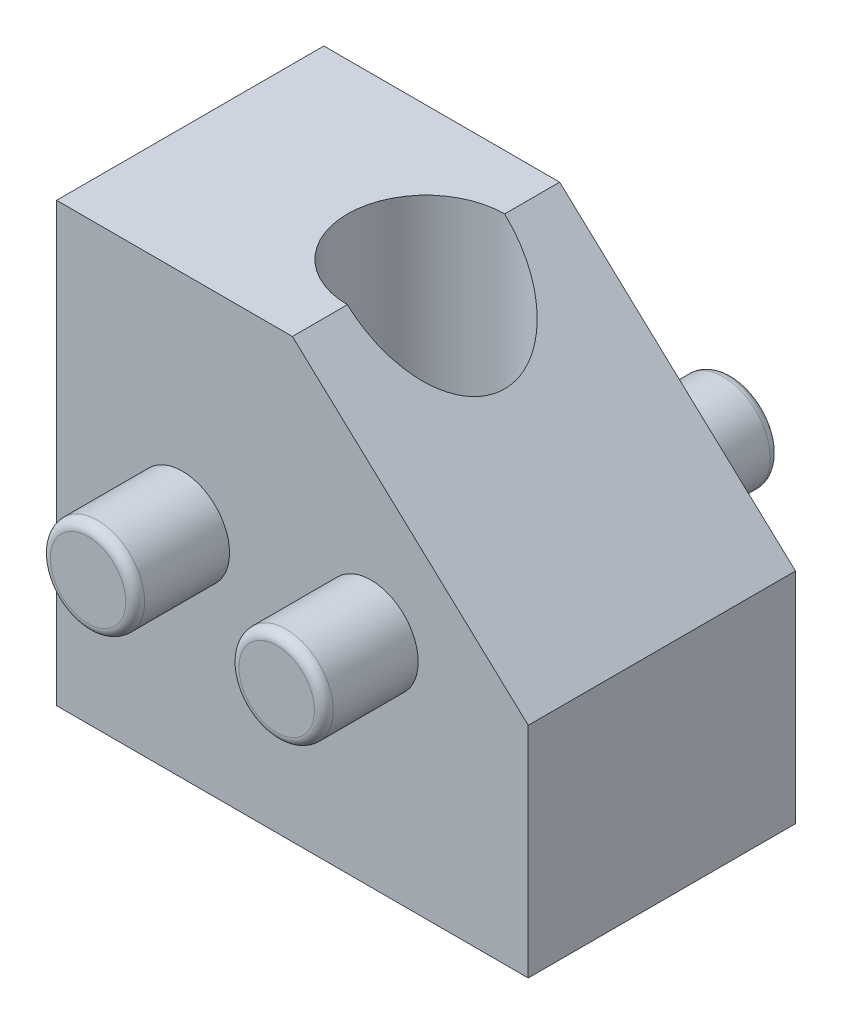
ISO-10303-21;
HEADER;
FILE_DESCRIPTION(('STEP AP214'),'2;1');
FILE_NAME('part.step','',(''),(''),'','','');
FILE_SCHEMA(('AUTOMOTIVE_DESIGN { 1 0 10303 214 1 1 1 1 }'));
ENDSEC;
DATA;
#1=APPLICATION_CONTEXT('core data for automotive mechanical design processes');
#2=APPLICATION_PROTOCOL_DEFINITION('international standard','automotive_design',2000,#1);
#3=PRODUCT_CONTEXT('',#1,'mechanical');
#4=PRODUCT('Part','Part','',(#3));
#5=PRODUCT_RELATED_PRODUCT_CATEGORY('part','',(#4));
#6=PRODUCT_DEFINITION_FORMATION('','',#4);
#7=PRODUCT_DEFINITION_CONTEXT('part definition',#1,'design');
#8=PRODUCT_DEFINITION('design','',#6,#7);
#9=PRODUCT_DEFINITION_SHAPE('','',#8);
#10=(LENGTH_UNIT() NAMED_UNIT(*) SI_UNIT(.MILLI.,.METRE.));
#11=(NAMED_UNIT(*) PLANE_ANGLE_UNIT() SI_UNIT($,.RADIAN.));
#12=(NAMED_UNIT(*) SI_UNIT($,.STERADIAN.) SOLID_ANGLE_UNIT());
#13=UNCERTAINTY_MEASURE_WITH_UNIT(LENGTH_MEASURE(1.E-05),#10,'distance_accuracy_value','');
#14=(GEOMETRIC_REPRESENTATION_CONTEXT(3) GLOBAL_UNCERTAINTY_ASSIGNED_CONTEXT((#13)) GLOBAL_UNIT_ASSIGNED_CONTEXT((#10,
#11,#12)) REPRESENTATION_CONTEXT('',''));
#15=CARTESIAN_POINT('',(0.,0.,0.));
#16=DIRECTION('',(0.,0.,1.));
#17=DIRECTION('',(1.,0.,0.));
#18=AXIS2_PLACEMENT_3D('',#15,#16,#17);
#19=CARTESIAN_POINT('',(8.93951134705922,0.,8.5));
#20=DIRECTION('',(1.,0.,0.));
#21=DIRECTION('',(0.,0.,-1.));
#22=AXIS2_PLACEMENT_3D('',#19,#20,#21);
#23=PLANE('',#22);
#24=DIRECTION('',(0.,-1.,0.));
#25=VECTOR('',#24,1.);
#26=CARTESIAN_POINT('',(8.93951134705922,0.,0.));
#27=LINE('',#26,#25);
#28=CARTESIAN_POINT('',(8.93951134705922,-1.33586653007096,0.));
#29=VERTEX_POINT('',#28);
#30=CARTESIAN_POINT('',(8.93951134705922,-8.29586653007096,0.));
#31=VERTEX_POINT('',#30);
#32=EDGE_CURVE('E123',#29,#31,#27,.T.);
#33=ORIENTED_EDGE('',*,*,#32,.F.);
#34=DIRECTION('',(0.,0.,-1.));
#35=VECTOR('',#34,1.);
#36=CARTESIAN_POINT('',(8.93951134705922,-1.33586653007096,8.5));
#37=LINE('',#36,#35);
#38=CARTESIAN_POINT('',(8.93951134705922,-1.33586653007096,8.5));
#39=VERTEX_POINT('',#38);
#40=EDGE_CURVE('E87',#39,#29,#37,.T.);
#41=ORIENTED_EDGE('',*,*,#40,.F.);
#42=DIRECTION('',(0.,-1.,0.));
#43=VECTOR('',#42,1.);
#44=CARTESIAN_POINT('',(8.93951134705922,0.,8.5));
#45=LINE('',#44,#43);
#46=CARTESIAN_POINT('',(8.93951134705922,-8.29586653007096,8.5));
#47=VERTEX_POINT('',#46);
#48=EDGE_CURVE('E118',#39,#47,#45,.T.);
#49=ORIENTED_EDGE('',*,*,#48,.T.);
#50=DIRECTION('',(0.,0.,-1.));
#51=VECTOR('',#50,1.);
#52=CARTESIAN_POINT('',(8.93951134705922,-8.29586653007096,8.5));
#53=LINE('',#52,#51);
#54=EDGE_CURVE('E82',#47,#31,#53,.T.);
#55=ORIENTED_EDGE('',*,*,#54,.T.);
#56=EDGE_LOOP('',(#33,#41,#49,#55));
#57=FACE_BOUND('',#56,.T.);
#58=ADVANCED_FACE('F35',(#57),#23,.T.);
#59=CARTESIAN_POINT('',(3.47030707334686,3.73955503593411,8.5));
#60=DIRECTION('',(-0.680226146057016,-0.73300231256144,0.));
#61=DIRECTION('',(0.73300231256144,-0.680226146057016,0.));
#62=AXIS2_PLACEMENT_3D('',#59,#60,#61);
#63=PLANE('',#62);
#64=DIRECTION('',(0.,0.,-1.));
#65=VECTOR('',#64,1.);
#66=CARTESIAN_POINT('',(1.43951134705922,5.62413346992904,8.5));
#67=LINE('',#66,#65);
#68=CARTESIAN_POINT('',(1.43951134705922,5.62413346992904,1.75));
#69=VERTEX_POINT('',#68);
#70=CARTESIAN_POINT('',(1.43951134705922,5.62413346992904,0.));
#71=VERTEX_POINT('',#70);
#72=EDGE_CURVE('E106',#69,#71,#67,.T.);
#73=ORIENTED_EDGE('',*,*,#72,.F.);
#74=CARTESIAN_POINT('',(1.43951134705922,5.62413346992904,4.25));
#75=DIRECTION('',(-0.680226146057016,-0.73300231256144,0.));
#76=DIRECTION('',(0.73300231256144,-0.680226146057016,0.));
#77=AXIS2_PLACEMENT_3D('',#74,#75,#76);
#78=ELLIPSE('',#77,3.41063044025587,2.5);
#79=CARTESIAN_POINT('',(1.43951134705922,5.62413346992904,6.75));
#80=VERTEX_POINT('',#79);
#81=EDGE_CURVE('E140',#69,#80,#78,.T.);
#82=ORIENTED_EDGE('',*,*,#81,.T.);
#83=CARTESIAN_POINT('',(1.43951134705922,5.62413346992904,8.5));
#84=VERTEX_POINT('',#83);
#85=EDGE_CURVE('E137',#84,#80,#67,.T.);
#86=ORIENTED_EDGE('',*,*,#85,.F.);
#87=DIRECTION('',(-0.73300231256144,0.680226146057016,0.));
#88=VECTOR('',#87,1.);
#89=CARTESIAN_POINT('',(3.47030707334686,3.73955503593411,8.5));
#90=LINE('',#89,#88);
#91=EDGE_CURVE('E115',#39,#84,#90,.T.);
#92=ORIENTED_EDGE('',*,*,#91,.F.);
#93=ORIENTED_EDGE('',*,*,#40,.T.);
#94=DIRECTION('',(-0.73300231256144,0.680226146057016,0.));
#95=VECTOR('',#94,1.);
#96=CARTESIAN_POINT('',(3.47030707334686,3.73955503593411,0.));
#97=LINE('',#96,#95);
#98=EDGE_CURVE('E126',#29,#71,#97,.T.);
#99=ORIENTED_EDGE('',*,*,#98,.T.);
#100=EDGE_LOOP('',(#73,#82,#86,#92,#93,#99));
#101=FACE_BOUND('',#100,.T.);
#102=ADVANCED_FACE('F174',(#101),#63,.F.);
#103=CARTESIAN_POINT('',(0.,5.62413346992904,8.5));
#104=DIRECTION('',(0.,1.,0.));
#105=DIRECTION('',(0.,0.,1.));
#106=AXIS2_PLACEMENT_3D('',#103,#104,#105);
#107=PLANE('',#106);
#108=CARTESIAN_POINT('',(1.43951134705922,5.62413346992904,4.25));
#109=DIRECTION('',(0.,1.,0.));
#110=DIRECTION('',(0.,0.,1.));
#111=AXIS2_PLACEMENT_3D('',#108,#109,#110);
#112=CIRCLE('',#111,2.5);
#113=EDGE_CURVE('E49',#69,#80,#112,.T.);
#114=ORIENTED_EDGE('',*,*,#113,.F.);
#115=ORIENTED_EDGE('',*,*,#72,.T.);
#116=DIRECTION('',(1.,0.,0.));
#117=VECTOR('',#116,1.);
#118=CARTESIAN_POINT('',(0.,5.62413346992904,0.));
#119=LINE('',#118,#117);
#120=CARTESIAN_POINT('',(-6.06048865294078,5.62413346992904,0.));
#121=VERTEX_POINT('',#120);
#122=EDGE_CURVE('E103',#121,#71,#119,.T.);
#123=ORIENTED_EDGE('',*,*,#122,.F.);
#124=DIRECTION('',(0.,0.,-1.));
#125=VECTOR('',#124,1.);
#126=CARTESIAN_POINT('',(-6.06048865294078,5.62413346992904,8.5));
#127=LINE('',#126,#125);
#128=CARTESIAN_POINT('',(-6.06048865294078,5.62413346992904,8.5));
#129=VERTEX_POINT('',#128);
#130=EDGE_CURVE('E96',#129,#121,#127,.T.);
#131=ORIENTED_EDGE('',*,*,#130,.F.);
#132=DIRECTION('',(1.,0.,0.));
#133=VECTOR('',#132,1.);
#134=CARTESIAN_POINT('',(0.,5.62413346992904,8.5));
#135=LINE('',#134,#133);
#136=EDGE_CURVE('E101',#129,#84,#135,.T.);
#137=ORIENTED_EDGE('',*,*,#136,.T.);
#138=ORIENTED_EDGE('',*,*,#85,.T.);
#139=EDGE_LOOP('',(#114,#115,#123,#131,#137,#138));
#140=FACE_BOUND('',#139,.T.);
#141=ADVANCED_FACE('F98',(#140),#107,.T.);
#142=CARTESIAN_POINT('',(-6.06048865294078,0.,8.5));
#143=DIRECTION('',(1.,0.,0.));
#144=DIRECTION('',(0.,1.,0.));
#145=AXIS2_PLACEMENT_3D('',#142,#143,#144);
#146=PLANE('',#145);
#147=DIRECTION('',(0.,-1.,0.));
#148=VECTOR('',#147,1.);
#149=CARTESIAN_POINT('',(-6.06048865294078,0.,0.));
#150=LINE('',#149,#148);
#151=CARTESIAN_POINT('',(-6.06048865294078,-8.29586653007096,0.));
#152=VERTEX_POINT('',#151);
#153=EDGE_CURVE('E131',#121,#152,#150,.T.);
#154=ORIENTED_EDGE('',*,*,#153,.T.);
#155=DIRECTION('',(0.,0.,-1.));
#156=VECTOR('',#155,1.);
#157=CARTESIAN_POINT('',(-6.06048865294078,-8.29586653007096,8.5));
#158=LINE('',#157,#156);
#159=CARTESIAN_POINT('',(-6.06048865294078,-8.29586653007096,8.5));
#160=VERTEX_POINT('',#159);
#161=EDGE_CURVE('E107',#160,#152,#158,.T.);
#162=ORIENTED_EDGE('',*,*,#161,.F.);
#163=DIRECTION('',(0.,-1.,0.));
#164=VECTOR('',#163,1.);
#165=CARTESIAN_POINT('',(-6.06048865294078,0.,8.5));
#166=LINE('',#165,#164);
#167=EDGE_CURVE('E110',#129,#160,#166,.T.);
#168=ORIENTED_EDGE('',*,*,#167,.F.);
#169=ORIENTED_EDGE('',*,*,#130,.T.);
#170=EDGE_LOOP('',(#154,#162,#168,#169));
#171=FACE_BOUND('',#170,.T.);
#172=ADVANCED_FACE('F111',(#171),#146,.F.);
#173=CARTESIAN_POINT('',(0.,-8.29586653007096,8.5));
#174=DIRECTION('',(0.,1.,0.));
#175=DIRECTION('',(0.,0.,1.));
#176=AXIS2_PLACEMENT_3D('',#173,#174,#175);
#177=PLANE('',#176);
#178=CARTESIAN_POINT('',(1.43951134705922,-8.29586653007096,4.25));
#179=DIRECTION('',(0.,-1.,0.));
#180=DIRECTION('',(0.,0.,-1.));
#181=AXIS2_PLACEMENT_3D('',#178,#179,#180);
#182=CIRCLE('',#181,2.5);
#183=CARTESIAN_POINT('',(1.43951134705922,-8.29586653007096,1.75));
#184=VERTEX_POINT('',#183);
#185=EDGE_CURVE('E217',#184,#184,#182,.T.);
#186=ORIENTED_EDGE('',*,*,#185,.F.);
#187=EDGE_LOOP('',(#186));
#188=FACE_BOUND('',#187,.T.);
#189=DIRECTION('',(1.,0.,0.));
#190=VECTOR('',#189,1.);
#191=CARTESIAN_POINT('',(0.,-8.29586653007096,0.));
#192=LINE('',#191,#190);
#193=EDGE_CURVE('E133',#152,#31,#192,.T.);
#194=ORIENTED_EDGE('',*,*,#193,.T.);
#195=ORIENTED_EDGE('',*,*,#54,.F.);
#196=DIRECTION('',(1.,0.,0.));
#197=VECTOR('',#196,1.);
#198=CARTESIAN_POINT('',(0.,-8.29586653007096,8.5));
#199=LINE('',#198,#197);
#200=EDGE_CURVE('E58',#160,#47,#199,.T.);
#201=ORIENTED_EDGE('',*,*,#200,.F.);
#202=ORIENTED_EDGE('',*,*,#161,.T.);
#203=EDGE_LOOP('',(#194,#195,#201,#202));
#204=FACE_BOUND('',#203,.T.);
#205=ADVANCED_FACE('F222',(#188,#204),#177,.F.);
#206=CARTESIAN_POINT('',(0.,0.,8.5));
#207=DIRECTION('',(0.,0.,1.));
#208=DIRECTION('',(1.,0.,0.));
#209=AXIS2_PLACEMENT_3D('',#206,#207,#208);
#210=PLANE('',#209);
#211=CARTESIAN_POINT('',(3.93951134705922,-1.33586653007095,8.5));
#212=DIRECTION('',(0.,0.,1.));
#213=DIRECTION('',(1.,0.,0.));
#214=AXIS2_PLACEMENT_3D('',#211,#212,#213);
#215=CIRCLE('',#214,1.5);
#216=CARTESIAN_POINT('',(5.43951134705922,-1.33586653007095,8.5));
#217=VERTEX_POINT('',#216);
#218=EDGE_CURVE('E211',#217,#217,#215,.F.);
#219=ORIENTED_EDGE('',*,*,#218,.T.);
#220=EDGE_LOOP('',(#219));
#221=FACE_BOUND('',#220,.T.);
#222=CARTESIAN_POINT('',(-2.06048865294078,-1.33586653007096,8.5));
#223=DIRECTION('',(0.,0.,1.));
#224=DIRECTION('',(1.,0.,0.));
#225=AXIS2_PLACEMENT_3D('',#222,#223,#224);
#226=CIRCLE('',#225,1.5);
#227=CARTESIAN_POINT('',(-0.560488652940779,-1.33586653007096,8.5));
#228=VERTEX_POINT('',#227);
#229=EDGE_CURVE('E206',#228,#228,#226,.F.);
#230=ORIENTED_EDGE('',*,*,#229,.T.);
#231=EDGE_LOOP('',(#230));
#232=FACE_BOUND('',#231,.T.);
#233=ORIENTED_EDGE('',*,*,#48,.F.);
#234=ORIENTED_EDGE('',*,*,#91,.T.);
#235=ORIENTED_EDGE('',*,*,#136,.F.);
#236=ORIENTED_EDGE('',*,*,#167,.T.);
#237=ORIENTED_EDGE('',*,*,#200,.T.);
#238=EDGE_LOOP('',(#233,#234,#235,#236,#237));
#239=FACE_BOUND('',#238,.T.);
#240=ADVANCED_FACE('F114',(#221,#232,#239),#210,.T.);
#241=CARTESIAN_POINT('',(0.,0.,0.));
#242=DIRECTION('',(0.,0.,1.));
#243=DIRECTION('',(1.,0.,0.));
#244=AXIS2_PLACEMENT_3D('',#241,#242,#243);
#245=PLANE('',#244);
#246=CARTESIAN_POINT('',(-2.06048865294078,-1.33586653007096,0.));
#247=DIRECTION('',(0.,0.,1.));
#248=DIRECTION('',(1.,0.,0.));
#249=AXIS2_PLACEMENT_3D('',#246,#247,#248);
#250=CIRCLE('',#249,1.5);
#251=CARTESIAN_POINT('',(-0.560488652940779,-1.33586653007096,0.));
#252=VERTEX_POINT('',#251);
#253=EDGE_CURVE('E204',#252,#252,#250,.T.);
#254=ORIENTED_EDGE('',*,*,#253,.T.);
#255=EDGE_LOOP('',(#254));
#256=FACE_BOUND('',#255,.T.);
#257=CARTESIAN_POINT('',(3.93951134705922,-1.33586653007095,0.));
#258=DIRECTION('',(0.,0.,1.));
#259=DIRECTION('',(1.,0.,0.));
#260=AXIS2_PLACEMENT_3D('',#257,#258,#259);
#261=CIRCLE('',#260,1.5);
#262=CARTESIAN_POINT('',(5.43951134705922,-1.33586653007095,0.));
#263=VERTEX_POINT('',#262);
#264=EDGE_CURVE('E127',#263,#263,#261,.T.);
#265=ORIENTED_EDGE('',*,*,#264,.T.);
#266=EDGE_LOOP('',(#265));
#267=FACE_BOUND('',#266,.T.);
#268=ORIENTED_EDGE('',*,*,#32,.T.);
#269=ORIENTED_EDGE('',*,*,#193,.F.);
#270=ORIENTED_EDGE('',*,*,#153,.F.);
#271=ORIENTED_EDGE('',*,*,#122,.T.);
#272=ORIENTED_EDGE('',*,*,#98,.F.);
#273=EDGE_LOOP('',(#268,#269,#270,#271,#272));
#274=FACE_BOUND('',#273,.T.);
#275=ADVANCED_FACE('F229',(#256,#267,#274),#245,.F.);
#276=CARTESIAN_POINT('',(3.93951134705922,-1.33586653007095,-3.));
#277=DIRECTION('',(0.,0.,1.));
#278=DIRECTION('',(1.,0.,0.));
#279=AXIS2_PLACEMENT_3D('',#276,#277,#278);
#280=CYLINDRICAL_SURFACE('',#279,1.5);
#281=CARTESIAN_POINT('',(3.93951134705922,-1.33586653007095,-2.7));
#282=DIRECTION('',(0.,0.,1.));
#283=DIRECTION('',(1.,0.,0.));
#284=AXIS2_PLACEMENT_3D('',#281,#282,#283);
#285=CIRCLE('',#284,1.5);
#286=CARTESIAN_POINT('',(5.43951134705922,-1.33586653007095,-2.7));
#287=VERTEX_POINT('',#286);
#288=EDGE_CURVE('E142',#287,#287,#285,.T.);
#289=ORIENTED_EDGE('',*,*,#288,.T.);
#290=EDGE_LOOP('',(#289));
#291=FACE_BOUND('',#290,.T.);
#292=ORIENTED_EDGE('',*,*,#264,.F.);
#293=EDGE_LOOP('',(#292));
#294=FACE_BOUND('',#293,.T.);
#295=ADVANCED_FACE('F255',(#291,#294),#280,.T.);
#296=CARTESIAN_POINT('',(0.,0.,-3.));
#297=DIRECTION('',(0.,0.,1.));
#298=DIRECTION('',(1.,0.,0.));
#299=AXIS2_PLACEMENT_3D('',#296,#297,#298);
#300=PLANE('',#299);
#301=CARTESIAN_POINT('',(3.93951134705922,-1.33586653007095,-3.));
#302=DIRECTION('',(0.,0.,1.));
#303=DIRECTION('',(1.,0.,0.));
#304=AXIS2_PLACEMENT_3D('',#301,#302,#303);
#305=CIRCLE('',#304,1.2);
#306=CARTESIAN_POINT('',(5.13951134705922,-1.33586653007095,-3.));
#307=VERTEX_POINT('',#306);
#308=EDGE_CURVE('E145',#307,#307,#305,.F.);
#309=ORIENTED_EDGE('',*,*,#308,.T.);
#310=EDGE_LOOP('',(#309));
#311=FACE_BOUND('',#310,.T.);
#312=ADVANCED_FACE('F200',(#311),#300,.F.);
#313=CARTESIAN_POINT('',(-2.06048865294078,-1.33586653007096,-3.));
#314=DIRECTION('',(0.,0.,1.));
#315=DIRECTION('',(1.,0.,0.));
#316=AXIS2_PLACEMENT_3D('',#313,#314,#315);
#317=CYLINDRICAL_SURFACE('',#316,1.5);
#318=CARTESIAN_POINT('',(-2.06048865294078,-1.33586653007096,-2.7));
#319=DIRECTION('',(0.,0.,1.));
#320=DIRECTION('',(1.,0.,0.));
#321=AXIS2_PLACEMENT_3D('',#318,#319,#320);
#322=CIRCLE('',#321,1.5);
#323=CARTESIAN_POINT('',(-0.560488652940779,-1.33586653007096,-2.7));
#324=VERTEX_POINT('',#323);
#325=EDGE_CURVE('E148',#324,#324,#322,.T.);
#326=ORIENTED_EDGE('',*,*,#325,.T.);
#327=EDGE_LOOP('',(#326));
#328=FACE_BOUND('',#327,.T.);
#329=ORIENTED_EDGE('',*,*,#253,.F.);
#330=EDGE_LOOP('',(#329));
#331=FACE_BOUND('',#330,.T.);
#332=ADVANCED_FACE('F196',(#328,#331),#317,.T.);
#333=CARTESIAN_POINT('',(0.,0.,-3.));
#334=DIRECTION('',(0.,0.,1.));
#335=DIRECTION('',(1.,0.,0.));
#336=AXIS2_PLACEMENT_3D('',#333,#334,#335);
#337=PLANE('',#336);
#338=CARTESIAN_POINT('',(-2.06048865294078,-1.33586653007096,-3.));
#339=DIRECTION('',(0.,0.,1.));
#340=DIRECTION('',(1.,0.,0.));
#341=AXIS2_PLACEMENT_3D('',#338,#339,#340);
#342=CIRCLE('',#341,1.2);
#343=CARTESIAN_POINT('',(-0.860488652940779,-1.33586653007096,-3.));
#344=VERTEX_POINT('',#343);
#345=EDGE_CURVE('E151',#344,#344,#342,.F.);
#346=ORIENTED_EDGE('',*,*,#345,.T.);
#347=EDGE_LOOP('',(#346));
#348=FACE_BOUND('',#347,.T.);
#349=ADVANCED_FACE('F199',(#348),#337,.F.);
#350=CARTESIAN_POINT('',(-2.06048865294078,-1.33586653007096,11.5));
#351=DIRECTION('',(0.,0.,-1.));
#352=DIRECTION('',(-1.,0.,0.));
#353=AXIS2_PLACEMENT_3D('',#350,#351,#352);
#354=CYLINDRICAL_SURFACE('',#353,1.5);
#355=CARTESIAN_POINT('',(-2.06048865294078,-1.33586653007096,11.2));
#356=DIRECTION('',(0.,0.,1.));
#357=DIRECTION('',(1.,0.,0.));
#358=AXIS2_PLACEMENT_3D('',#355,#356,#357);
#359=CIRCLE('',#358,1.5);
#360=CARTESIAN_POINT('',(-0.560488652940779,-1.33586653007096,11.2));
#361=VERTEX_POINT('',#360);
#362=EDGE_CURVE('E11',#361,#361,#359,.F.);
#363=ORIENTED_EDGE('',*,*,#362,.T.);
#364=EDGE_LOOP('',(#363));
#365=FACE_BOUND('',#364,.T.);
#366=ORIENTED_EDGE('',*,*,#229,.F.);
#367=EDGE_LOOP('',(#366));
#368=FACE_BOUND('',#367,.T.);
#369=ADVANCED_FACE('F246',(#365,#368),#354,.T.);
#370=CARTESIAN_POINT('',(-2.06048865294078,-1.33586653007096,11.5));
#371=DIRECTION('',(0.,0.,1.));
#372=DIRECTION('',(1.,0.,0.));
#373=AXIS2_PLACEMENT_3D('',#370,#371,#372);
#374=PLANE('',#373);
#375=CARTESIAN_POINT('',(-2.06048865294078,-1.33586653007096,11.5));
#376=DIRECTION('',(0.,0.,1.));
#377=DIRECTION('',(1.,0.,0.));
#378=AXIS2_PLACEMENT_3D('',#375,#376,#377);
#379=CIRCLE('',#378,1.2);
#380=CARTESIAN_POINT('',(-0.860488652940779,-1.33586653007096,11.5));
#381=VERTEX_POINT('',#380);
#382=EDGE_CURVE('E43',#381,#381,#379,.T.);
#383=ORIENTED_EDGE('',*,*,#382,.T.);
#384=EDGE_LOOP('',(#383));
#385=FACE_BOUND('',#384,.T.);
#386=ADVANCED_FACE('F162',(#385),#374,.T.);
#387=CARTESIAN_POINT('',(3.93951134705922,-1.33586653007095,11.5));
#388=DIRECTION('',(0.,0.,-1.));
#389=DIRECTION('',(-1.,0.,0.));
#390=AXIS2_PLACEMENT_3D('',#387,#388,#389);
#391=CYLINDRICAL_SURFACE('',#390,1.5);
#392=CARTESIAN_POINT('',(3.93951134705922,-1.33586653007095,11.2));
#393=DIRECTION('',(0.,0.,1.));
#394=DIRECTION('',(1.,0.,0.));
#395=AXIS2_PLACEMENT_3D('',#392,#393,#394);
#396=CIRCLE('',#395,1.5);
#397=CARTESIAN_POINT('',(5.43951134705922,-1.33586653007095,11.2));
#398=VERTEX_POINT('',#397);
#399=EDGE_CURVE('E157',#398,#398,#396,.F.);
#400=ORIENTED_EDGE('',*,*,#399,.T.);
#401=EDGE_LOOP('',(#400));
#402=FACE_BOUND('',#401,.T.);
#403=ORIENTED_EDGE('',*,*,#218,.F.);
#404=EDGE_LOOP('',(#403));
#405=FACE_BOUND('',#404,.T.);
#406=ADVANCED_FACE('F237',(#402,#405),#391,.T.);
#407=CARTESIAN_POINT('',(3.93951134705922,-1.33586653007095,11.5));
#408=DIRECTION('',(0.,0.,1.));
#409=DIRECTION('',(1.,0.,0.));
#410=AXIS2_PLACEMENT_3D('',#407,#408,#409);
#411=PLANE('',#410);
#412=CARTESIAN_POINT('',(3.93951134705922,-1.33586653007095,11.5));
#413=DIRECTION('',(0.,0.,1.));
#414=DIRECTION('',(1.,0.,0.));
#415=AXIS2_PLACEMENT_3D('',#412,#413,#414);
#416=CIRCLE('',#415,1.2);
#417=CARTESIAN_POINT('',(5.13951134705922,-1.33586653007095,11.5));
#418=VERTEX_POINT('',#417);
#419=EDGE_CURVE('E154',#418,#418,#416,.T.);
#420=ORIENTED_EDGE('',*,*,#419,.T.);
#421=EDGE_LOOP('',(#420));
#422=FACE_BOUND('',#421,.T.);
#423=ADVANCED_FACE('F232',(#422),#411,.T.);
#424=CARTESIAN_POINT('',(1.43951134705922,-8.29586653007096,4.25));
#425=DIRECTION('',(0.,-1.,0.));
#426=DIRECTION('',(0.,0.,-1.));
#427=AXIS2_PLACEMENT_3D('',#424,#425,#426);
#428=CYLINDRICAL_SURFACE('',#427,2.5);
#429=ORIENTED_EDGE('',*,*,#113,.T.);
#430=ORIENTED_EDGE('',*,*,#81,.F.);
#431=EDGE_LOOP('',(#429,#430));
#432=FACE_BOUND('',#431,.T.);
#433=ORIENTED_EDGE('',*,*,#185,.T.);
#434=EDGE_LOOP('',(#433));
#435=FACE_BOUND('',#434,.T.);
#436=ADVANCED_FACE('F186',(#432,#435),#428,.F.);
#437=CARTESIAN_POINT('',(3.93951134705922,-1.33586653007095,-2.7));
#438=DIRECTION('',(0.,0.,1.));
#439=DIRECTION('',(1.,0.,0.));
#440=AXIS2_PLACEMENT_3D('',#437,#438,#439);
#441=TOROIDAL_SURFACE('',#440,1.2,0.3);
#442=ORIENTED_EDGE('',*,*,#308,.F.);
#443=EDGE_LOOP('',(#442));
#444=FACE_BOUND('',#443,.T.);
#445=ORIENTED_EDGE('',*,*,#288,.F.);
#446=EDGE_LOOP('',(#445));
#447=FACE_BOUND('',#446,.T.);
#448=ADVANCED_FACE('F183',(#444,#447),#441,.T.);
#449=CARTESIAN_POINT('',(-2.06048865294078,-1.33586653007096,-2.7));
#450=DIRECTION('',(0.,0.,1.));
#451=DIRECTION('',(1.,0.,0.));
#452=AXIS2_PLACEMENT_3D('',#449,#450,#451);
#453=TOROIDAL_SURFACE('',#452,1.2,0.3);
#454=ORIENTED_EDGE('',*,*,#345,.F.);
#455=EDGE_LOOP('',(#454));
#456=FACE_BOUND('',#455,.T.);
#457=ORIENTED_EDGE('',*,*,#325,.F.);
#458=EDGE_LOOP('',(#457));
#459=FACE_BOUND('',#458,.T.);
#460=ADVANCED_FACE('F170',(#456,#459),#453,.T.);
#461=CARTESIAN_POINT('',(3.93951134705922,-1.33586653007095,11.2));
#462=DIRECTION('',(0.,0.,1.));
#463=DIRECTION('',(1.,0.,0.));
#464=AXIS2_PLACEMENT_3D('',#461,#462,#463);
#465=TOROIDAL_SURFACE('',#464,1.2,0.3);
#466=ORIENTED_EDGE('',*,*,#399,.F.);
#467=EDGE_LOOP('',(#466));
#468=FACE_BOUND('',#467,.T.);
#469=ORIENTED_EDGE('',*,*,#419,.F.);
#470=EDGE_LOOP('',(#469));
#471=FACE_BOUND('',#470,.T.);
#472=ADVANCED_FACE('F165',(#468,#471),#465,.T.);
#473=CARTESIAN_POINT('',(-2.06048865294078,-1.33586653007096,11.2));
#474=DIRECTION('',(0.,0.,1.));
#475=DIRECTION('',(1.,0.,0.));
#476=AXIS2_PLACEMENT_3D('',#473,#474,#475);
#477=TOROIDAL_SURFACE('',#476,1.2,0.3);
#478=ORIENTED_EDGE('',*,*,#362,.F.);
#479=EDGE_LOOP('',(#478));
#480=FACE_BOUND('',#479,.T.);
#481=ORIENTED_EDGE('',*,*,#382,.F.);
#482=EDGE_LOOP('',(#481));
#483=FACE_BOUND('',#482,.T.);
#484=ADVANCED_FACE('F37',(#480,#483),#477,.T.);
#485=CLOSED_SHELL('',(#58,#102,#141,#172,#205,#240,#275,#295,#312,#332,#349,#369,#386,#406,#423,
#436,#448,#460,#472,#484));
#486=MANIFOLD_SOLID_BREP('B2',#485);
#487=ADVANCED_BREP_SHAPE_REPRESENTATION('',(#18,#486),#14);
#488=SHAPE_DEFINITION_REPRESENTATION(#9,#487);
ENDSEC;
END-ISO-10303-21;
